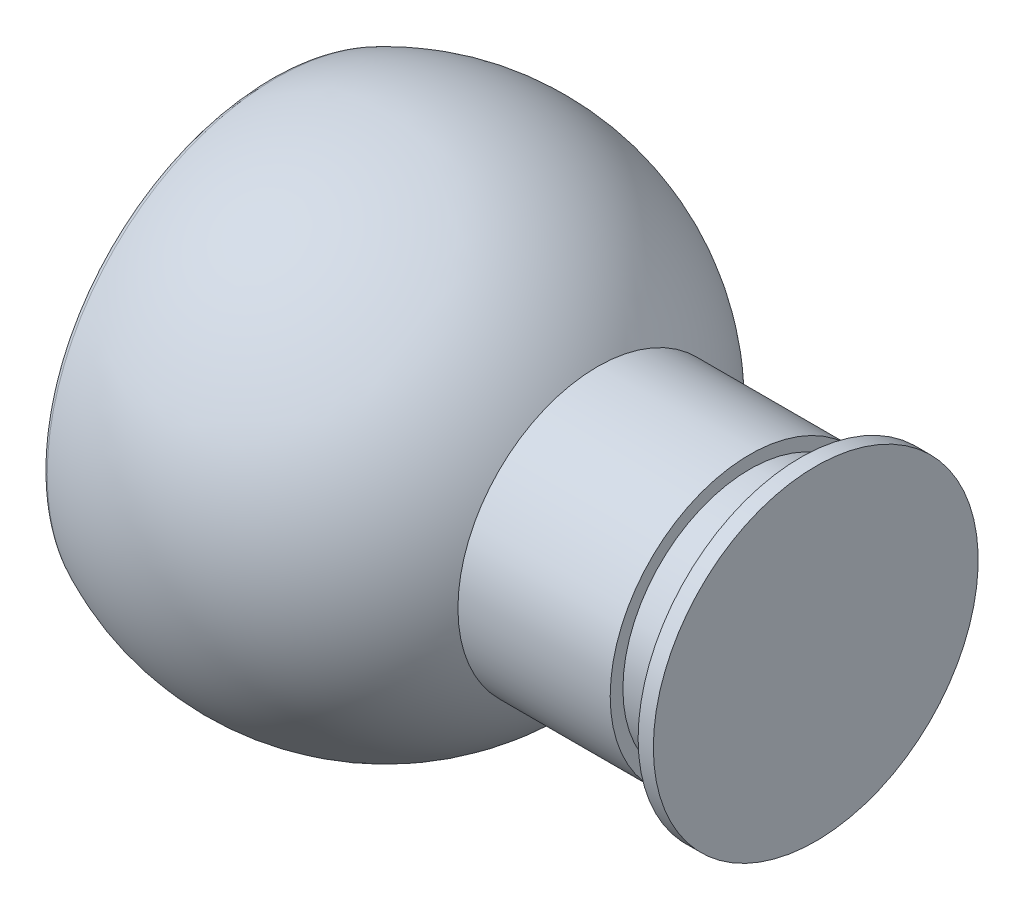
ISO-10303-21;
HEADER;
FILE_DESCRIPTION(('STEP AP214'),'2;1');
FILE_NAME('part.step','',(''),(''),'','','');
FILE_SCHEMA(('AUTOMOTIVE_DESIGN { 1 0 10303 214 1 1 1 1 }'));
ENDSEC;
DATA;
#1=APPLICATION_CONTEXT('core data for automotive mechanical design processes');
#2=APPLICATION_PROTOCOL_DEFINITION('international standard','automotive_design',2000,#1);
#3=PRODUCT_CONTEXT('',#1,'mechanical');
#4=PRODUCT('Part','Part','',(#3));
#5=PRODUCT_RELATED_PRODUCT_CATEGORY('part','',(#4));
#6=PRODUCT_DEFINITION_FORMATION('','',#4);
#7=PRODUCT_DEFINITION_CONTEXT('part definition',#1,'design');
#8=PRODUCT_DEFINITION('design','',#6,#7);
#9=PRODUCT_DEFINITION_SHAPE('','',#8);
#10=(LENGTH_UNIT() NAMED_UNIT(*) SI_UNIT(.MILLI.,.METRE.));
#11=(NAMED_UNIT(*) PLANE_ANGLE_UNIT() SI_UNIT($,.RADIAN.));
#12=(NAMED_UNIT(*) SI_UNIT($,.STERADIAN.) SOLID_ANGLE_UNIT());
#13=UNCERTAINTY_MEASURE_WITH_UNIT(LENGTH_MEASURE(1.E-05),#10,'distance_accuracy_value','');
#14=(GEOMETRIC_REPRESENTATION_CONTEXT(3) GLOBAL_UNCERTAINTY_ASSIGNED_CONTEXT((#13)) GLOBAL_UNIT_ASSIGNED_CONTEXT((#10,
#11,#12)) REPRESENTATION_CONTEXT('',''));
#15=CARTESIAN_POINT('',(0.,0.,0.));
#16=DIRECTION('',(0.,0.,1.));
#17=DIRECTION('',(1.,0.,0.));
#18=AXIS2_PLACEMENT_3D('',#15,#16,#17);
#19=CARTESIAN_POINT('',(-5.,0.,0.));
#20=DIRECTION('',(-1.,0.,0.));
#21=DIRECTION('',(0.,0.,1.));
#22=AXIS2_PLACEMENT_3D('',#19,#20,#21);
#23=CYLINDRICAL_SURFACE('',#22,3.2);
#24=CARTESIAN_POINT('',(8.17582327212252,0.,0.));
#25=DIRECTION('',(-1.,0.,0.));
#26=DIRECTION('',(0.,0.,1.));
#27=AXIS2_PLACEMENT_3D('',#24,#25,#26);
#28=CIRCLE('',#27,3.2);
#29=CARTESIAN_POINT('',(8.17582327212252,0.,3.2));
#30=VERTEX_POINT('',#29);
#31=EDGE_CURVE('E41',#30,#30,#28,.T.);
#32=ORIENTED_EDGE('',*,*,#31,.F.);
#33=EDGE_LOOP('',(#32));
#34=FACE_BOUND('',#33,.T.);
#35=CARTESIAN_POINT('',(8.47582327212252,0.,0.));
#36=DIRECTION('',(-1.,0.,0.));
#37=DIRECTION('',(0.,0.,1.));
#38=AXIS2_PLACEMENT_3D('',#35,#36,#37);
#39=CIRCLE('',#38,3.2);
#40=CARTESIAN_POINT('',(8.47582327212252,0.,3.2));
#41=VERTEX_POINT('',#40);
#42=EDGE_CURVE('E59',#41,#41,#39,.T.);
#43=ORIENTED_EDGE('',*,*,#42,.T.);
#44=EDGE_LOOP('',(#43));
#45=FACE_BOUND('',#44,.T.);
#46=ADVANCED_FACE('F31',(#34,#45),#23,.T.);
#47=CARTESIAN_POINT('',(8.17582327212252,2.5,0.));
#48=DIRECTION('',(1.,0.,0.));
#49=DIRECTION('',(0.,0.,-1.));
#50=AXIS2_PLACEMENT_3D('',#47,#48,#49);
#51=PLANE('',#50);
#52=CARTESIAN_POINT('',(8.17582327212252,0.,0.));
#53=DIRECTION('',(-1.,0.,0.));
#54=DIRECTION('',(0.,0.,1.));
#55=AXIS2_PLACEMENT_3D('',#52,#53,#54);
#56=CIRCLE('',#55,2.5);
#57=CARTESIAN_POINT('',(8.17582327212252,0.,2.5));
#58=VERTEX_POINT('',#57);
#59=EDGE_CURVE('E45',#58,#58,#56,.T.);
#60=ORIENTED_EDGE('',*,*,#59,.F.);
#61=EDGE_LOOP('',(#60));
#62=FACE_BOUND('',#61,.T.);
#63=ORIENTED_EDGE('',*,*,#31,.T.);
#64=EDGE_LOOP('',(#63));
#65=FACE_BOUND('',#64,.T.);
#66=ADVANCED_FACE('F78',(#62,#65),#51,.F.);
#67=CARTESIAN_POINT('',(-5.,0.,0.));
#68=DIRECTION('',(-1.,0.,0.));
#69=DIRECTION('',(0.,0.,1.));
#70=AXIS2_PLACEMENT_3D('',#67,#68,#69);
#71=CYLINDRICAL_SURFACE('',#70,2.5);
#72=CARTESIAN_POINT('',(7.17582327212252,0.,0.));
#73=DIRECTION('',(-1.,0.,0.));
#74=DIRECTION('',(0.,0.,1.));
#75=AXIS2_PLACEMENT_3D('',#72,#73,#74);
#76=CIRCLE('',#75,2.5);
#77=CARTESIAN_POINT('',(7.17582327212252,0.,2.5));
#78=VERTEX_POINT('',#77);
#79=EDGE_CURVE('E50',#78,#78,#76,.T.);
#80=ORIENTED_EDGE('',*,*,#79,.F.);
#81=EDGE_LOOP('',(#80));
#82=FACE_BOUND('',#81,.T.);
#83=ORIENTED_EDGE('',*,*,#59,.T.);
#84=EDGE_LOOP('',(#83));
#85=FACE_BOUND('',#84,.T.);
#86=ADVANCED_FACE('F83',(#82,#85),#71,.T.);
#87=CARTESIAN_POINT('',(7.17582327212252,2.75,0.));
#88=DIRECTION('',(-1.,0.,0.));
#89=DIRECTION('',(0.,0.,1.));
#90=AXIS2_PLACEMENT_3D('',#87,#88,#89);
#91=PLANE('',#90);
#92=CARTESIAN_POINT('',(7.17582327212252,0.,0.));
#93=DIRECTION('',(-1.,0.,0.));
#94=DIRECTION('',(0.,0.,1.));
#95=AXIS2_PLACEMENT_3D('',#92,#93,#94);
#96=CIRCLE('',#95,2.75);
#97=CARTESIAN_POINT('',(7.17582327212252,0.,2.75));
#98=VERTEX_POINT('',#97);
#99=EDGE_CURVE('E53',#98,#98,#96,.T.);
#100=ORIENTED_EDGE('',*,*,#99,.F.);
#101=EDGE_LOOP('',(#100));
#102=FACE_BOUND('',#101,.T.);
#103=ORIENTED_EDGE('',*,*,#79,.T.);
#104=EDGE_LOOP('',(#103));
#105=FACE_BOUND('',#104,.T.);
#106=ADVANCED_FACE('F90',(#102,#105),#91,.F.);
#107=CARTESIAN_POINT('',(-5.,0.,0.));
#108=DIRECTION('',(-1.,0.,0.));
#109=DIRECTION('',(0.,0.,1.));
#110=AXIS2_PLACEMENT_3D('',#107,#108,#109);
#111=CYLINDRICAL_SURFACE('',#110,2.75);
#112=CARTESIAN_POINT('',(4.17582327212252,0.,0.));
#113=DIRECTION('',(-1.,0.,0.));
#114=DIRECTION('',(0.,0.,1.));
#115=AXIS2_PLACEMENT_3D('',#112,#113,#114);
#116=CIRCLE('',#115,2.75);
#117=CARTESIAN_POINT('',(4.17582327212252,2.75,0.));
#118=VERTEX_POINT('',#117);
#119=EDGE_CURVE('E56',#118,#118,#116,.T.);
#120=ORIENTED_EDGE('',*,*,#119,.F.);
#121=EDGE_LOOP('',(#120));
#122=FACE_BOUND('',#121,.T.);
#123=ORIENTED_EDGE('',*,*,#99,.T.);
#124=EDGE_LOOP('',(#123));
#125=FACE_BOUND('',#124,.T.);
#126=ADVANCED_FACE('F97',(#122,#125),#111,.T.);
#127=CARTESIAN_POINT('',(0.,0.,0.));
#128=DIRECTION('',(-1.,0.,0.));
#129=DIRECTION('',(0.,1.,0.));
#130=AXIS2_PLACEMENT_3D('',#127,#128,#129);
#131=SPHERICAL_SURFACE('',#130,5.);
#132=CARTESIAN_POINT('',(-2.153379497742,0.,0.));
#133=DIRECTION('',(1.,0.,0.));
#134=DIRECTION('',(0.,0.,-1.));
#135=AXIS2_PLACEMENT_3D('',#132,#133,#134);
#136=CIRCLE('',#135,4.51253329502447);
#137=CARTESIAN_POINT('',(-2.153379497742,4.51253329502447,0.));
#138=VERTEX_POINT('',#137);
#139=EDGE_CURVE('E10',#138,#138,#136,.T.);
#140=CARTESIAN_POINT('',(-2.153379497742,4.51253329502447,0.));
#141=CARTESIAN_POINT('',(-2.08598934364412,4.54469319044794,0.));
#142=CARTESIAN_POINT('',(-2.01787786111924,4.57534128257856,0.));
#143=CARTESIAN_POINT('',(-1.88035099667625,4.63355722768045,0.));
#144=CARTESIAN_POINT('',(-1.81093561475814,4.66112508065173,0.));
#145=CARTESIAN_POINT('',(-1.67093970898945,4.71312391486133,0.));
#146=CARTESIAN_POINT('',(-1.60035918513887,4.73755489609966,0.));
#147=CARTESIAN_POINT('',(-1.45817479247351,4.78323130608925,0.));
#148=CARTESIAN_POINT('',(-1.38657092365873,4.8044767348405,0.));
#149=CARTESIAN_POINT('',(-1.24248350391652,4.84373930838982,0.));
#150=CARTESIAN_POINT('',(-1.1699999529891,4.86175645318787,0.));
#151=CARTESIAN_POINT('',(-1.02429864765828,4.89452632516562,0.));
#152=CARTESIAN_POINT('',(-0.951080893254884,4.90927905234532,0.));
#153=CARTESIAN_POINT('',(-0.804058119600403,4.93549047494953,0.));
#154=CARTESIAN_POINT('',(-0.730253100349315,4.94694917037405,0.));
#155=CARTESIAN_POINT('',(-0.582203917830076,4.96654953469631,0.));
#156=CARTESIAN_POINT('',(-0.507959754561926,4.97469120359404,0.));
#157=CARTESIAN_POINT('',(-0.359181285193456,4.9876411747786,0.));
#158=CARTESIAN_POINT('',(-0.284646979093137,4.99244947706542,0.));
#159=CARTESIAN_POINT('',(-0.135437807795416,4.99872306532543,0.));
#160=CARTESIAN_POINT('',(-0.0607629425980138,5.00018835129861,0.));
#161=CARTESIAN_POINT('',(0.0885774811387951,4.99977296619886,0.));
#162=CARTESIAN_POINT('',(0.163243039678202,4.99789229512592,0.));
#163=CARTESIAN_POINT('',(0.31241500300294,4.9907887702817,0.));
#164=CARTESIAN_POINT('',(0.386921407788271,4.98556591651043,0.));
#165=CARTESIAN_POINT('',(0.535625535921108,4.97178850806704,0.));
#166=CARTESIAN_POINT('',(0.609823259268613,4.96323395339492,0.));
#167=CARTESIAN_POINT('',(0.757761116336724,4.94281031137596,0.));
#168=CARTESIAN_POINT('',(0.83150125005733,4.93094122402912,0.));
#169=CARTESIAN_POINT('',(0.978375938024343,4.90391233685635,0.));
#170=CARTESIAN_POINT('',(1.05151049227075,4.88875253703042,0.));
#171=CARTESIAN_POINT('',(1.19702724678577,4.85517264926071,0.));
#172=CARTESIAN_POINT('',(1.26940944705438,4.83675256131693,0.));
#173=CARTESIAN_POINT('',(1.41327622901732,4.7966890647791,0.));
#174=CARTESIAN_POINT('',(1.48476081071165,4.77504565618504,0.));
#175=CARTESIAN_POINT('',(1.62668889236967,4.72857895473027,0.));
#176=CARTESIAN_POINT('',(1.69713239233335,4.70375566186954,0.));
#177=CARTESIAN_POINT('',(1.83683693673151,4.65097901000805,0.));
#178=CARTESIAN_POINT('',(1.90609798116598,4.62302565100729,0.));
#179=CARTESIAN_POINT('',(2.04329861378975,4.56404496675505,0.));
#180=CARTESIAN_POINT('',(2.11123820197903,4.53301764150357,0.));
#181=CARTESIAN_POINT('',(2.2456595734401,4.46795129381377,0.));
#182=CARTESIAN_POINT('',(2.31214135671188,4.43391227137545,0.));
#183=CARTESIAN_POINT('',(2.44351369535234,4.36289084258453,0.));
#184=CARTESIAN_POINT('',(2.50840425072103,4.32590843623192,0.));
#185=CARTESIAN_POINT('',(2.63646390401133,4.24907445998548,0.));
#186=CARTESIAN_POINT('',(2.69963300193294,4.20922289009164,0.));
#187=CARTESIAN_POINT('',(2.82412296563479,4.12673056531824,0.));
#188=CARTESIAN_POINT('',(2.88544383141503,4.08408981043868,0.));
#189=CARTESIAN_POINT('',(3.00611426523189,3.99610469178923,0.));
#190=CARTESIAN_POINT('',(3.0654638332685,3.95076032801935,0.));
#191=CARTESIAN_POINT('',(3.18207256275296,3.85745899397636,0.));
#192=CARTESIAN_POINT('',(3.2393317242008,3.80950202370325,0.));
#193=CARTESIAN_POINT('',(3.35164472490986,3.71107172085032,0.));
#194=CARTESIAN_POINT('',(3.40669856417108,3.6605983882705,0.));
#195=CARTESIAN_POINT('',(3.51449043830065,3.55723666055574,0.));
#196=CARTESIAN_POINT('',(3.56722847316899,3.50434826542081,0.));
#197=CARTESIAN_POINT('',(3.67028287590076,3.3962625388549,0.));
#198=CARTESIAN_POINT('',(3.72059924376419,3.34106520742393,0.));
#199=CARTESIAN_POINT('',(3.81870941450716,3.22847244413988,0.));
#200=CARTESIAN_POINT('',(3.86650321738671,3.17107701228681,0.));
#201=CARTESIAN_POINT('',(3.95947203250631,3.05420301258452,0.));
#202=CARTESIAN_POINT('',(4.00464704474638,2.99472444473531,0.));
#203=CARTESIAN_POINT('',(4.09228876500054,2.87380437370275,0.));
#204=CARTESIAN_POINT('',(4.13475547301464,2.81236287051941,0.));
#205=CARTESIAN_POINT('',(4.17582327212252,2.75,0.));
#206=B_SPLINE_CURVE_WITH_KNOTS('',3,(#140,#141,#142,#143,#144,#145,#146,#147,#148,#149,#150,
#151,#152,#153,#154,#155,#156,#157,#158,#159,#160,#161,#162,#163,#164,#165,#166,#167,#168,#169,
#170,#171,#172,#173,#174,#175,#176,#177,#178,#179,#180,#181,#182,#183,#184,#185,#186,#187,#188,
#189,#190,#191,#192,#193,#194,#195,#196,#197,#198,#199,#200,#201,#202,#203,#204,#205),
.UNSPECIFIED.,.F.,.F.,(4,2,2,2,2,2,2,2,2,2,2,2,2,2,2,2,2,2,2,2,2,2,2,2,2,2,2,2,2,2,2,2,4),(0.,
0.223992772365498,0.447985544730996,0.671978317096494,0.895971089461992,1.11996386182749,
1.34395663419299,1.56794940655849,1.79194217892398,2.01593495128948,2.23992772365498,
2.46392049602048,2.68791326838598,2.91190604075147,3.13589881311697,3.35989158548247,
3.58388435784797,3.80787713021347,4.03186990257896,4.25586267494446,4.47985544730996,
4.70384821967546,4.92784099204096,5.15183376440645,5.37582653677195,5.59981930913745,
5.82381208150295,6.04780485386845,6.27179762623394,6.49579039859944,6.71978317096494,
6.94377594333044,7.16776871569594),.UNSPECIFIED.);
#207=EDGE_CURVE('BSEAM75',#138,#118,#206,.T.);
#208=ORIENTED_EDGE('',*,*,#139,.T.);
#209=ORIENTED_EDGE('',*,*,#119,.T.);
#210=ORIENTED_EDGE('',*,*,#207,.T.);
#211=ORIENTED_EDGE('',*,*,#207,.F.);
#212=EDGE_LOOP('',(#208,#210,#209,#211));
#213=FACE_BOUND('',#212,.T.);
#214=ADVANCED_FACE('F75',(#213),#131,.T.);
#215=CARTESIAN_POINT('',(-2.32417672787748,0.,0.));
#216=DIRECTION('',(1.,0.,0.));
#217=DIRECTION('',(0.,0.,-1.));
#218=AXIS2_PLACEMENT_3D('',#215,#216,#217);
#219=PLANE('',#218);
#220=CARTESIAN_POINT('',(-2.32417672787748,0.,0.));
#221=DIRECTION('',(1.,0.,0.));
#222=DIRECTION('',(0.,0.,-1.));
#223=AXIS2_PLACEMENT_3D('',#220,#221,#222);
#224=CIRCLE('',#223,4.241781297323);
#225=CARTESIAN_POINT('',(-2.32417672787748,0.,-4.241781297323));
#226=VERTEX_POINT('',#225);
#227=EDGE_CURVE('E37',#226,#226,#224,.F.);
#228=ORIENTED_EDGE('',*,*,#227,.T.);
#229=EDGE_LOOP('',(#228));
#230=FACE_BOUND('',#229,.T.);
#231=ADVANCED_FACE('F67',(#230),#219,.F.);
#232=CARTESIAN_POINT('',(8.47582327212252,3.2,0.));
#233=DIRECTION('',(-1.,0.,0.));
#234=DIRECTION('',(0.,0.,1.));
#235=AXIS2_PLACEMENT_3D('',#232,#233,#234);
#236=PLANE('',#235);
#237=ORIENTED_EDGE('',*,*,#42,.F.);
#238=EDGE_LOOP('',(#237));
#239=FACE_BOUND('',#238,.T.);
#240=ADVANCED_FACE('F64',(#239),#236,.F.);
#241=CARTESIAN_POINT('',(-2.02417672787748,0.,0.));
#242=DIRECTION('',(1.,0.,0.));
#243=DIRECTION('',(0.,0.,-1.));
#244=AXIS2_PLACEMENT_3D('',#241,#242,#243);
#245=TOROIDAL_SURFACE('',#244,4.241781297323,0.3);
#246=ORIENTED_EDGE('',*,*,#139,.F.);
#247=EDGE_LOOP('',(#246));
#248=FACE_BOUND('',#247,.T.);
#249=ORIENTED_EDGE('',*,*,#227,.F.);
#250=EDGE_LOOP('',(#249));
#251=FACE_BOUND('',#250,.T.);
#252=ADVANCED_FACE('F66',(#248,#251),#245,.T.);
#253=CLOSED_SHELL('',(#46,#66,#86,#106,#126,#214,#231,#240,#252));
#254=MANIFOLD_SOLID_BREP('B2',#253);
#255=ADVANCED_BREP_SHAPE_REPRESENTATION('',(#18,#254),#14);
#256=SHAPE_DEFINITION_REPRESENTATION(#9,#255);
ENDSEC;
END-ISO-10303-21;
